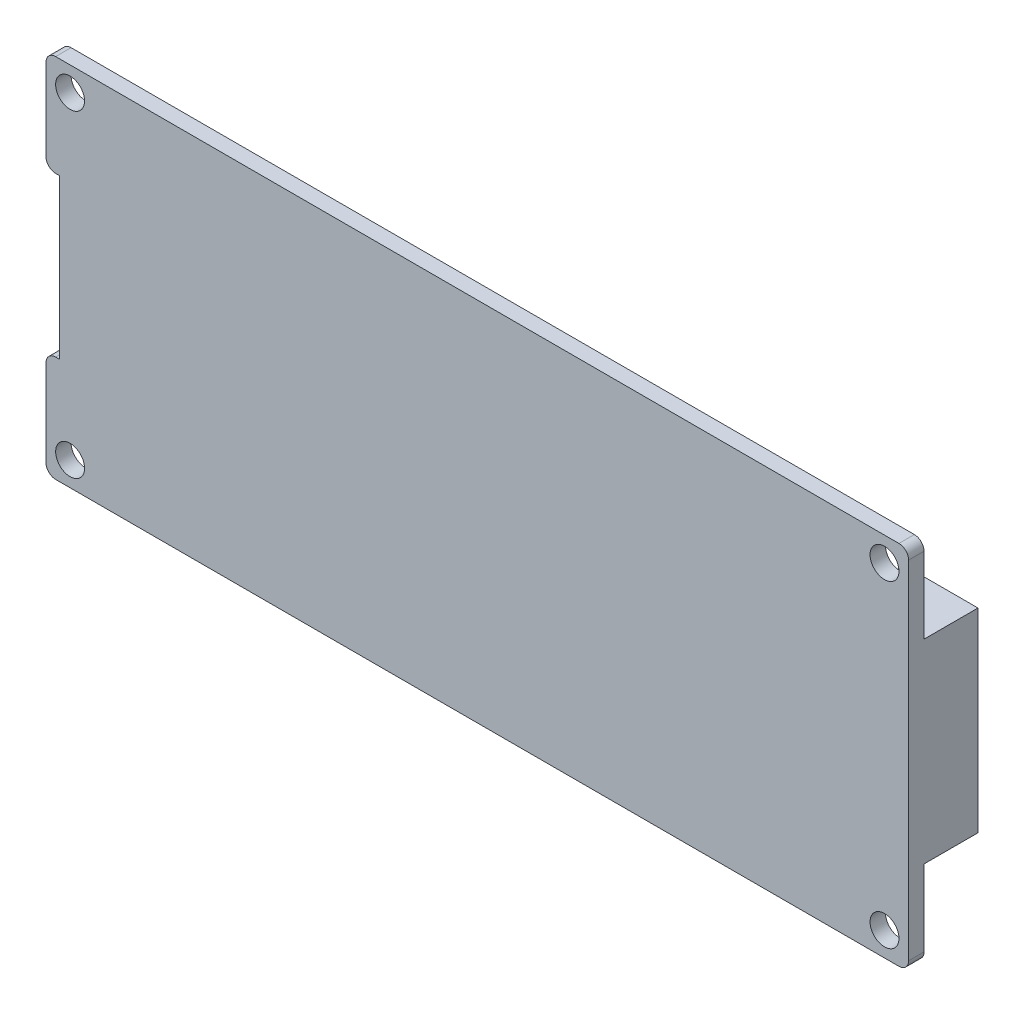
ISO-10303-21;
HEADER;
FILE_DESCRIPTION(('STEP AP214'),'2;1');
FILE_NAME('part.step','',(''),(''),'','','');
FILE_SCHEMA(('AUTOMOTIVE_DESIGN { 1 0 10303 214 1 1 1 1 }'));
ENDSEC;
DATA;
#1=APPLICATION_CONTEXT('core data for automotive mechanical design processes');
#2=APPLICATION_PROTOCOL_DEFINITION('international standard','automotive_design',2000,#1);
#3=PRODUCT_CONTEXT('',#1,'mechanical');
#4=PRODUCT('Part','Part','',(#3));
#5=PRODUCT_RELATED_PRODUCT_CATEGORY('part','',(#4));
#6=PRODUCT_DEFINITION_FORMATION('','',#4);
#7=PRODUCT_DEFINITION_CONTEXT('part definition',#1,'design');
#8=PRODUCT_DEFINITION('design','',#6,#7);
#9=PRODUCT_DEFINITION_SHAPE('','',#8);
#10=(LENGTH_UNIT() NAMED_UNIT(*) SI_UNIT(.MILLI.,.METRE.));
#11=(NAMED_UNIT(*) PLANE_ANGLE_UNIT() SI_UNIT($,.RADIAN.));
#12=(NAMED_UNIT(*) SI_UNIT($,.STERADIAN.) SOLID_ANGLE_UNIT());
#13=UNCERTAINTY_MEASURE_WITH_UNIT(LENGTH_MEASURE(1.E-05),#10,'distance_accuracy_value','');
#14=(GEOMETRIC_REPRESENTATION_CONTEXT(3) GLOBAL_UNCERTAINTY_ASSIGNED_CONTEXT((#13)) GLOBAL_UNIT_ASSIGNED_CONTEXT((#10,
#11,#12)) REPRESENTATION_CONTEXT('',''));
#15=CARTESIAN_POINT('',(0.,0.,0.));
#16=DIRECTION('',(0.,0.,1.));
#17=DIRECTION('',(1.,0.,0.));
#18=AXIS2_PLACEMENT_3D('',#15,#16,#17);
#19=CARTESIAN_POINT('',(37.1,-10.1,0.));
#20=DIRECTION('',(-1.,0.,0.));
#21=DIRECTION('',(0.,0.,1.));
#22=AXIS2_PLACEMENT_3D('',#19,#20,#21);
#23=PLANE('',#22);
#24=DIRECTION('',(0.,1.,0.));
#25=VECTOR('',#24,1.);
#26=CARTESIAN_POINT('',(37.1,0.,-5.6));
#27=LINE('',#26,#25);
#28=CARTESIAN_POINT('',(37.1,-10.1,-5.6));
#29=VERTEX_POINT('',#28);
#30=CARTESIAN_POINT('',(37.1,10.1,-5.6));
#31=VERTEX_POINT('',#30);
#32=EDGE_CURVE('E153',#29,#31,#27,.T.);
#33=ORIENTED_EDGE('',*,*,#32,.F.);
#34=DIRECTION('',(0.,0.,-1.));
#35=VECTOR('',#34,1.);
#36=CARTESIAN_POINT('',(37.1,-10.1,0.));
#37=LINE('',#36,#35);
#38=CARTESIAN_POINT('',(37.1,-10.1,0.));
#39=VERTEX_POINT('',#38);
#40=EDGE_CURVE('E147',#39,#29,#37,.T.);
#41=ORIENTED_EDGE('',*,*,#40,.F.);
#42=DIRECTION('',(0.,1.,0.));
#43=VECTOR('',#42,1.);
#44=CARTESIAN_POINT('',(37.1,0.,0.));
#45=LINE('',#44,#43);
#46=CARTESIAN_POINT('',(37.1,10.1,0.));
#47=VERTEX_POINT('',#46);
#48=EDGE_CURVE('E151',#39,#47,#45,.T.);
#49=ORIENTED_EDGE('',*,*,#48,.T.);
#50=DIRECTION('',(0.,0.,1.));
#51=VECTOR('',#50,1.);
#52=CARTESIAN_POINT('',(37.1,10.1,0.));
#53=LINE('',#52,#51);
#54=EDGE_CURVE('E188',#31,#47,#53,.T.);
#55=ORIENTED_EDGE('',*,*,#54,.F.);
#56=EDGE_LOOP('',(#33,#41,#49,#55));
#57=FACE_BOUND('',#56,.T.);
#58=ADVANCED_FACE('F17',(#57),#23,.T.);
#59=CARTESIAN_POINT('',(-43.35,-8.,0.));
#60=DIRECTION('',(0.,1.,0.));
#61=DIRECTION('',(-1.,0.,0.));
#62=AXIS2_PLACEMENT_3D('',#59,#60,#61);
#63=PLANE('',#62);
#64=DIRECTION('',(-1.,0.,0.));
#65=VECTOR('',#64,1.);
#66=CARTESIAN_POINT('',(-43.35,-8.,1.6));
#67=LINE('',#66,#65);
#68=CARTESIAN_POINT('',(-43.75,-8.,1.6));
#69=VERTEX_POINT('',#68);
#70=CARTESIAN_POINT('',(-43.35,-8.,1.6));
#71=VERTEX_POINT('',#70);
#72=EDGE_CURVE('E157',#69,#71,#67,.F.);
#73=ORIENTED_EDGE('',*,*,#72,.T.);
#74=DIRECTION('',(0.,0.,1.));
#75=VECTOR('',#74,1.);
#76=CARTESIAN_POINT('',(-43.35,-8.,0.));
#77=LINE('',#76,#75);
#78=CARTESIAN_POINT('',(-43.35,-8.,0.));
#79=VERTEX_POINT('',#78);
#80=EDGE_CURVE('E181',#79,#71,#77,.T.);
#81=ORIENTED_EDGE('',*,*,#80,.F.);
#82=DIRECTION('',(1.,0.,0.));
#83=VECTOR('',#82,1.);
#84=CARTESIAN_POINT('',(0.,-8.,0.));
#85=LINE('',#84,#83);
#86=CARTESIAN_POINT('',(-43.75,-8.,0.));
#87=VERTEX_POINT('',#86);
#88=EDGE_CURVE('E166',#79,#87,#85,.F.);
#89=ORIENTED_EDGE('',*,*,#88,.T.);
#90=DIRECTION('',(0.,0.,1.));
#91=VECTOR('',#90,1.);
#92=CARTESIAN_POINT('',(-43.75,-7.99999999999999,0.));
#93=LINE('',#92,#91);
#94=EDGE_CURVE('E263',#69,#87,#93,.F.);
#95=ORIENTED_EDGE('',*,*,#94,.F.);
#96=EDGE_LOOP('',(#73,#81,#89,#95));
#97=FACE_BOUND('',#96,.T.);
#98=ADVANCED_FACE('F369',(#97),#63,.T.);
#99=CARTESIAN_POINT('',(44.75,-10.1,0.));
#100=DIRECTION('',(0.,-1.,0.));
#101=DIRECTION('',(0.,0.,-1.));
#102=AXIS2_PLACEMENT_3D('',#99,#100,#101);
#103=PLANE('',#102);
#104=DIRECTION('',(-1.,0.,0.));
#105=VECTOR('',#104,1.);
#106=CARTESIAN_POINT('',(40.925,-10.1,-5.6));
#107=LINE('',#106,#105);
#108=CARTESIAN_POINT('',(44.75,-10.1,-5.6));
#109=VERTEX_POINT('',#108);
#110=EDGE_CURVE('E156',#109,#29,#107,.T.);
#111=ORIENTED_EDGE('',*,*,#110,.F.);
#112=DIRECTION('',(0.,0.,-1.));
#113=VECTOR('',#112,1.);
#114=CARTESIAN_POINT('',(44.75,-10.1,0.));
#115=LINE('',#114,#113);
#116=CARTESIAN_POINT('',(44.75,-10.1,0.));
#117=VERTEX_POINT('',#116);
#118=EDGE_CURVE('E163',#117,#109,#115,.T.);
#119=ORIENTED_EDGE('',*,*,#118,.F.);
#120=DIRECTION('',(1.,0.,0.));
#121=VECTOR('',#120,1.);
#122=CARTESIAN_POINT('',(0.,-10.1,0.));
#123=LINE('',#122,#121);
#124=EDGE_CURVE('E160',#117,#39,#123,.F.);
#125=ORIENTED_EDGE('',*,*,#124,.T.);
#126=ORIENTED_EDGE('',*,*,#40,.T.);
#127=EDGE_LOOP('',(#111,#119,#125,#126));
#128=FACE_BOUND('',#127,.T.);
#129=ADVANCED_FACE('F161',(#128),#103,.T.);
#130=CARTESIAN_POINT('',(40.925,0.,-5.6));
#131=DIRECTION('',(0.,0.,-1.));
#132=DIRECTION('',(-1.,0.,0.));
#133=AXIS2_PLACEMENT_3D('',#130,#131,#132);
#134=PLANE('',#133);
#135=DIRECTION('',(1.,0.,0.));
#136=VECTOR('',#135,1.);
#137=CARTESIAN_POINT('',(37.1,10.1,-5.6));
#138=LINE('',#137,#136);
#139=CARTESIAN_POINT('',(44.75,10.1,-5.6));
#140=VERTEX_POINT('',#139);
#141=EDGE_CURVE('E190',#140,#31,#138,.F.);
#142=ORIENTED_EDGE('',*,*,#141,.F.);
#143=DIRECTION('',(0.,1.,0.));
#144=VECTOR('',#143,1.);
#145=CARTESIAN_POINT('',(44.75,-18.,-5.6));
#146=LINE('',#145,#144);
#147=EDGE_CURVE('E200',#109,#140,#146,.T.);
#148=ORIENTED_EDGE('',*,*,#147,.F.);
#149=ORIENTED_EDGE('',*,*,#110,.T.);
#150=ORIENTED_EDGE('',*,*,#32,.T.);
#151=EDGE_LOOP('',(#142,#148,#149,#150));
#152=FACE_BOUND('',#151,.T.);
#153=ADVANCED_FACE('F414',(#152),#134,.T.);
#154=CARTESIAN_POINT('',(37.1,10.1,0.));
#155=DIRECTION('',(0.,1.,0.));
#156=DIRECTION('',(0.,0.,1.));
#157=AXIS2_PLACEMENT_3D('',#154,#155,#156);
#158=PLANE('',#157);
#159=ORIENTED_EDGE('',*,*,#141,.T.);
#160=ORIENTED_EDGE('',*,*,#54,.T.);
#161=DIRECTION('',(1.,0.,0.));
#162=VECTOR('',#161,1.);
#163=CARTESIAN_POINT('',(0.,10.1,0.));
#164=LINE('',#163,#162);
#165=CARTESIAN_POINT('',(44.75,10.1,0.));
#166=VERTEX_POINT('',#165);
#167=EDGE_CURVE('E171',#47,#166,#164,.T.);
#168=ORIENTED_EDGE('',*,*,#167,.T.);
#169=DIRECTION('',(0.,0.,-1.));
#170=VECTOR('',#169,1.);
#171=CARTESIAN_POINT('',(44.75,10.1,0.));
#172=LINE('',#171,#170);
#173=EDGE_CURVE('E203',#140,#166,#172,.F.);
#174=ORIENTED_EDGE('',*,*,#173,.F.);
#175=EDGE_LOOP('',(#159,#160,#168,#174));
#176=FACE_BOUND('',#175,.T.);
#177=ADVANCED_FACE('F411',(#176),#158,.T.);
#178=CARTESIAN_POINT('',(0.,0.,0.));
#179=DIRECTION('',(0.,0.,1.));
#180=DIRECTION('',(1.,0.,0.));
#181=AXIS2_PLACEMENT_3D('',#178,#179,#180);
#182=PLANE('',#181);
#183=ORIENTED_EDGE('',*,*,#124,.F.);
#184=DIRECTION('',(0.,1.,0.));
#185=VECTOR('',#184,1.);
#186=CARTESIAN_POINT('',(44.75,-18.,0.));
#187=LINE('',#186,#185);
#188=CARTESIAN_POINT('',(44.75,-18.,0.));
#189=VERTEX_POINT('',#188);
#190=EDGE_CURVE('E297',#189,#117,#187,.T.);
#191=ORIENTED_EDGE('',*,*,#190,.F.);
#192=CARTESIAN_POINT('',(43.75,-18.,0.));
#193=DIRECTION('',(0.,0.,1.));
#194=DIRECTION('',(1.,0.,0.));
#195=AXIS2_PLACEMENT_3D('',#192,#193,#194);
#196=CIRCLE('',#195,0.999999999999994);
#197=CARTESIAN_POINT('',(43.75,-19.,0.));
#198=VERTEX_POINT('',#197);
#199=EDGE_CURVE('E251',#198,#189,#196,.T.);
#200=ORIENTED_EDGE('',*,*,#199,.F.);
#201=DIRECTION('',(1.,0.,0.));
#202=VECTOR('',#201,1.);
#203=CARTESIAN_POINT('',(-43.75,-19.,0.));
#204=LINE('',#203,#202);
#205=CARTESIAN_POINT('',(-43.75,-19.,0.));
#206=VERTEX_POINT('',#205);
#207=EDGE_CURVE('E313',#206,#198,#204,.T.);
#208=ORIENTED_EDGE('',*,*,#207,.F.);
#209=CARTESIAN_POINT('',(-43.75,-18.,0.));
#210=DIRECTION('',(0.,0.,1.));
#211=DIRECTION('',(1.,0.,0.));
#212=AXIS2_PLACEMENT_3D('',#209,#210,#211);
#213=CIRCLE('',#212,0.999999999999996);
#214=CARTESIAN_POINT('',(-44.75,-18.,0.));
#215=VERTEX_POINT('',#214);
#216=EDGE_CURVE('E255',#215,#206,#213,.T.);
#217=ORIENTED_EDGE('',*,*,#216,.F.);
#218=DIRECTION('',(0.,1.,0.));
#219=VECTOR('',#218,1.);
#220=CARTESIAN_POINT('',(-44.75,-9.,0.));
#221=LINE('',#220,#219);
#222=CARTESIAN_POINT('',(-44.75,-8.99999999999999,0.));
#223=VERTEX_POINT('',#222);
#224=EDGE_CURVE('E316',#223,#215,#221,.F.);
#225=ORIENTED_EDGE('',*,*,#224,.F.);
#226=CARTESIAN_POINT('',(-43.75,-8.99999999999999,0.));
#227=DIRECTION('',(0.,0.,1.));
#228=DIRECTION('',(1.,0.,0.));
#229=AXIS2_PLACEMENT_3D('',#226,#227,#228);
#230=CIRCLE('',#229,0.999999999999996);
#231=EDGE_CURVE('E260',#87,#223,#230,.T.);
#232=ORIENTED_EDGE('',*,*,#231,.F.);
#233=ORIENTED_EDGE('',*,*,#88,.F.);
#234=DIRECTION('',(0.,1.,0.));
#235=VECTOR('',#234,1.);
#236=CARTESIAN_POINT('',(-43.35,8.5,0.));
#237=LINE('',#236,#235);
#238=CARTESIAN_POINT('',(-43.35,8.5,0.));
#239=VERTEX_POINT('',#238);
#240=EDGE_CURVE('E185',#239,#79,#237,.F.);
#241=ORIENTED_EDGE('',*,*,#240,.F.);
#242=DIRECTION('',(1.,0.,0.));
#243=VECTOR('',#242,1.);
#244=CARTESIAN_POINT('',(-43.75,8.5,0.));
#245=LINE('',#244,#243);
#246=CARTESIAN_POINT('',(-43.75,8.5,0.));
#247=VERTEX_POINT('',#246);
#248=EDGE_CURVE('E172',#247,#239,#245,.T.);
#249=ORIENTED_EDGE('',*,*,#248,.F.);
#250=CARTESIAN_POINT('',(-43.75,9.5,0.));
#251=DIRECTION('',(0.,0.,1.));
#252=DIRECTION('',(1.,0.,0.));
#253=AXIS2_PLACEMENT_3D('',#250,#251,#252);
#254=CIRCLE('',#253,0.999999999999996);
#255=CARTESIAN_POINT('',(-44.75,9.5,0.));
#256=VERTEX_POINT('',#255);
#257=EDGE_CURVE('E20',#256,#247,#254,.T.);
#258=ORIENTED_EDGE('',*,*,#257,.F.);
#259=DIRECTION('',(0.,1.,0.));
#260=VECTOR('',#259,1.);
#261=CARTESIAN_POINT('',(-44.75,18.,0.));
#262=LINE('',#261,#260);
#263=CARTESIAN_POINT('',(-44.75,18.,0.));
#264=VERTEX_POINT('',#263);
#265=EDGE_CURVE('E279',#264,#256,#262,.F.);
#266=ORIENTED_EDGE('',*,*,#265,.F.);
#267=CARTESIAN_POINT('',(-43.75,18.,0.));
#268=DIRECTION('',(0.,0.,1.));
#269=DIRECTION('',(1.,0.,0.));
#270=AXIS2_PLACEMENT_3D('',#267,#268,#269);
#271=CIRCLE('',#270,0.999999999999994);
#272=CARTESIAN_POINT('',(-43.75,19.,0.));
#273=VERTEX_POINT('',#272);
#274=EDGE_CURVE('E242',#273,#264,#271,.T.);
#275=ORIENTED_EDGE('',*,*,#274,.F.);
#276=DIRECTION('',(-1.,0.,0.));
#277=VECTOR('',#276,1.);
#278=CARTESIAN_POINT('',(43.75,19.,0.));
#279=LINE('',#278,#277);
#280=CARTESIAN_POINT('',(43.75,19.,0.));
#281=VERTEX_POINT('',#280);
#282=EDGE_CURVE('E288',#281,#273,#279,.T.);
#283=ORIENTED_EDGE('',*,*,#282,.F.);
#284=CARTESIAN_POINT('',(43.75,18.,0.));
#285=DIRECTION('',(0.,0.,1.));
#286=DIRECTION('',(1.,0.,0.));
#287=AXIS2_PLACEMENT_3D('',#284,#285,#286);
#288=CIRCLE('',#287,0.999999999999996);
#289=CARTESIAN_POINT('',(44.75,18.,0.));
#290=VERTEX_POINT('',#289);
#291=EDGE_CURVE('E247',#290,#281,#288,.T.);
#292=ORIENTED_EDGE('',*,*,#291,.F.);
#293=DIRECTION('',(0.,1.,0.));
#294=VECTOR('',#293,1.);
#295=CARTESIAN_POINT('',(44.75,-18.,0.));
#296=LINE('',#295,#294);
#297=EDGE_CURVE('E291',#166,#290,#296,.T.);
#298=ORIENTED_EDGE('',*,*,#297,.F.);
#299=ORIENTED_EDGE('',*,*,#167,.F.);
#300=ORIENTED_EDGE('',*,*,#48,.F.);
#301=EDGE_LOOP('',(#183,#191,#200,#208,#217,#225,#232,#233,#241,#249,#258,#266,#275,#283,#292,
#298,#299,#300));
#302=FACE_BOUND('',#301,.T.);
#303=CARTESIAN_POINT('',(-42.25,16.5,0.));
#304=DIRECTION('',(0.,0.,1.));
#305=DIRECTION('',(1.,0.,0.));
#306=AXIS2_PLACEMENT_3D('',#303,#304,#305);
#307=CIRCLE('',#306,1.49999999999999);
#308=CARTESIAN_POINT('',(-40.75,16.5,0.));
#309=VERTEX_POINT('',#308);
#310=EDGE_CURVE('E264',#309,#309,#307,.T.);
#311=ORIENTED_EDGE('',*,*,#310,.T.);
#312=EDGE_LOOP('',(#311));
#313=FACE_BOUND('',#312,.T.);
#314=CARTESIAN_POINT('',(42.25,16.5,0.));
#315=DIRECTION('',(0.,0.,1.));
#316=DIRECTION('',(1.,0.,0.));
#317=AXIS2_PLACEMENT_3D('',#314,#315,#316);
#318=CIRCLE('',#317,1.49999999999999);
#319=CARTESIAN_POINT('',(43.75,16.5,0.));
#320=VERTEX_POINT('',#319);
#321=EDGE_CURVE('E267',#320,#320,#318,.T.);
#322=ORIENTED_EDGE('',*,*,#321,.T.);
#323=EDGE_LOOP('',(#322));
#324=FACE_BOUND('',#323,.T.);
#325=CARTESIAN_POINT('',(42.25,-16.5,0.));
#326=DIRECTION('',(0.,0.,1.));
#327=DIRECTION('',(1.,0.,0.));
#328=AXIS2_PLACEMENT_3D('',#325,#326,#327);
#329=CIRCLE('',#328,1.49999999999999);
#330=CARTESIAN_POINT('',(43.75,-16.5,0.));
#331=VERTEX_POINT('',#330);
#332=EDGE_CURVE('E270',#331,#331,#329,.T.);
#333=ORIENTED_EDGE('',*,*,#332,.T.);
#334=EDGE_LOOP('',(#333));
#335=FACE_BOUND('',#334,.T.);
#336=CARTESIAN_POINT('',(-42.25,-16.5,0.));
#337=DIRECTION('',(0.,0.,1.));
#338=DIRECTION('',(1.,0.,0.));
#339=AXIS2_PLACEMENT_3D('',#336,#337,#338);
#340=CIRCLE('',#339,1.49999999999999);
#341=CARTESIAN_POINT('',(-40.75,-16.5,0.));
#342=VERTEX_POINT('',#341);
#343=EDGE_CURVE('E272',#342,#342,#340,.T.);
#344=ORIENTED_EDGE('',*,*,#343,.T.);
#345=EDGE_LOOP('',(#344));
#346=FACE_BOUND('',#345,.T.);
#347=ADVANCED_FACE('F168',(#302,#313,#324,#335,#346),#182,.F.);
#348=CARTESIAN_POINT('',(-43.75,8.5,0.));
#349=DIRECTION('',(0.,-1.,0.));
#350=DIRECTION('',(0.,0.,-1.));
#351=AXIS2_PLACEMENT_3D('',#348,#349,#350);
#352=PLANE('',#351);
#353=DIRECTION('',(1.,0.,0.));
#354=VECTOR('',#353,1.);
#355=CARTESIAN_POINT('',(-43.75,8.5,1.6));
#356=LINE('',#355,#354);
#357=CARTESIAN_POINT('',(-43.35,8.5,1.6));
#358=VERTEX_POINT('',#357);
#359=CARTESIAN_POINT('',(-43.75,8.5,1.6));
#360=VERTEX_POINT('',#359);
#361=EDGE_CURVE('E35',#358,#360,#356,.F.);
#362=ORIENTED_EDGE('',*,*,#361,.T.);
#363=DIRECTION('',(0.,0.,1.));
#364=VECTOR('',#363,1.);
#365=CARTESIAN_POINT('',(-43.75,8.5,0.));
#366=LINE('',#365,#364);
#367=EDGE_CURVE('E338',#247,#360,#366,.T.);
#368=ORIENTED_EDGE('',*,*,#367,.F.);
#369=ORIENTED_EDGE('',*,*,#248,.T.);
#370=DIRECTION('',(0.,0.,1.));
#371=VECTOR('',#370,1.);
#372=CARTESIAN_POINT('',(-43.35,8.5,0.));
#373=LINE('',#372,#371);
#374=EDGE_CURVE('E184',#358,#239,#373,.F.);
#375=ORIENTED_EDGE('',*,*,#374,.F.);
#376=EDGE_LOOP('',(#362,#368,#369,#375));
#377=FACE_BOUND('',#376,.T.);
#378=ADVANCED_FACE('F337',(#377),#352,.T.);
#379=CARTESIAN_POINT('',(-42.25,-16.5,0.));
#380=DIRECTION('',(0.,0.,1.));
#381=DIRECTION('',(1.,0.,0.));
#382=AXIS2_PLACEMENT_3D('',#379,#380,#381);
#383=CYLINDRICAL_SURFACE('',#382,1.49999999999999);
#384=CARTESIAN_POINT('',(-42.25,-16.5,1.6));
#385=DIRECTION('',(0.,0.,1.));
#386=DIRECTION('',(1.,0.,0.));
#387=AXIS2_PLACEMENT_3D('',#384,#385,#386);
#388=CIRCLE('',#387,1.49999999999999);
#389=CARTESIAN_POINT('',(-40.75,-16.5,1.6));
#390=VERTEX_POINT('',#389);
#391=EDGE_CURVE('E238',#390,#390,#388,.F.);
#392=ORIENTED_EDGE('',*,*,#391,.F.);
#393=EDGE_LOOP('',(#392));
#394=FACE_BOUND('',#393,.T.);
#395=ORIENTED_EDGE('',*,*,#343,.F.);
#396=EDGE_LOOP('',(#395));
#397=FACE_BOUND('',#396,.T.);
#398=ADVANCED_FACE('F393',(#394,#397),#383,.F.);
#399=CARTESIAN_POINT('',(42.25,-16.5,0.));
#400=DIRECTION('',(0.,0.,1.));
#401=DIRECTION('',(1.,0.,0.));
#402=AXIS2_PLACEMENT_3D('',#399,#400,#401);
#403=CYLINDRICAL_SURFACE('',#402,1.49999999999999);
#404=CARTESIAN_POINT('',(42.25,-16.5,1.6));
#405=DIRECTION('',(0.,0.,1.));
#406=DIRECTION('',(1.,0.,0.));
#407=AXIS2_PLACEMENT_3D('',#404,#405,#406);
#408=CIRCLE('',#407,1.49999999999999);
#409=CARTESIAN_POINT('',(43.75,-16.5,1.6));
#410=VERTEX_POINT('',#409);
#411=EDGE_CURVE('E235',#410,#410,#408,.F.);
#412=ORIENTED_EDGE('',*,*,#411,.F.);
#413=EDGE_LOOP('',(#412));
#414=FACE_BOUND('',#413,.T.);
#415=ORIENTED_EDGE('',*,*,#332,.F.);
#416=EDGE_LOOP('',(#415));
#417=FACE_BOUND('',#416,.T.);
#418=ADVANCED_FACE('F396',(#414,#417),#403,.F.);
#419=CARTESIAN_POINT('',(42.25,16.5,0.));
#420=DIRECTION('',(0.,0.,1.));
#421=DIRECTION('',(1.,0.,0.));
#422=AXIS2_PLACEMENT_3D('',#419,#420,#421);
#423=CYLINDRICAL_SURFACE('',#422,1.49999999999999);
#424=CARTESIAN_POINT('',(42.25,16.5,1.6));
#425=DIRECTION('',(0.,0.,1.));
#426=DIRECTION('',(1.,0.,0.));
#427=AXIS2_PLACEMENT_3D('',#424,#425,#426);
#428=CIRCLE('',#427,1.49999999999999);
#429=CARTESIAN_POINT('',(43.75,16.5,1.6));
#430=VERTEX_POINT('',#429);
#431=EDGE_CURVE('E232',#430,#430,#428,.F.);
#432=ORIENTED_EDGE('',*,*,#431,.F.);
#433=EDGE_LOOP('',(#432));
#434=FACE_BOUND('',#433,.T.);
#435=ORIENTED_EDGE('',*,*,#321,.F.);
#436=EDGE_LOOP('',(#435));
#437=FACE_BOUND('',#436,.T.);
#438=ADVANCED_FACE('F403',(#434,#437),#423,.F.);
#439=CARTESIAN_POINT('',(-42.25,16.5,0.));
#440=DIRECTION('',(0.,0.,1.));
#441=DIRECTION('',(1.,0.,0.));
#442=AXIS2_PLACEMENT_3D('',#439,#440,#441);
#443=CYLINDRICAL_SURFACE('',#442,1.49999999999999);
#444=CARTESIAN_POINT('',(-42.25,16.5,1.6));
#445=DIRECTION('',(0.,0.,1.));
#446=DIRECTION('',(1.,0.,0.));
#447=AXIS2_PLACEMENT_3D('',#444,#445,#446);
#448=CIRCLE('',#447,1.49999999999999);
#449=CARTESIAN_POINT('',(-40.75,16.5,1.6));
#450=VERTEX_POINT('',#449);
#451=EDGE_CURVE('E229',#450,#450,#448,.F.);
#452=ORIENTED_EDGE('',*,*,#451,.F.);
#453=EDGE_LOOP('',(#452));
#454=FACE_BOUND('',#453,.T.);
#455=ORIENTED_EDGE('',*,*,#310,.F.);
#456=EDGE_LOOP('',(#455));
#457=FACE_BOUND('',#456,.T.);
#458=ADVANCED_FACE('F486',(#454,#457),#443,.F.);
#459=CARTESIAN_POINT('',(-43.35,8.5,0.));
#460=DIRECTION('',(-1.,0.,0.));
#461=DIRECTION('',(0.,0.,1.));
#462=AXIS2_PLACEMENT_3D('',#459,#460,#461);
#463=PLANE('',#462);
#464=DIRECTION('',(0.,1.,0.));
#465=VECTOR('',#464,1.);
#466=CARTESIAN_POINT('',(-43.35,0.,1.6));
#467=LINE('',#466,#465);
#468=EDGE_CURVE('E228',#358,#71,#467,.F.);
#469=ORIENTED_EDGE('',*,*,#468,.F.);
#470=ORIENTED_EDGE('',*,*,#374,.T.);
#471=ORIENTED_EDGE('',*,*,#240,.T.);
#472=ORIENTED_EDGE('',*,*,#80,.T.);
#473=EDGE_LOOP('',(#469,#470,#471,#472));
#474=FACE_BOUND('',#473,.T.);
#475=ADVANCED_FACE('F334',(#474),#463,.T.);
#476=CARTESIAN_POINT('',(-43.75,-8.99999999999999,0.));
#477=DIRECTION('',(0.,0.,1.));
#478=DIRECTION('',(1.,0.,0.));
#479=AXIS2_PLACEMENT_3D('',#476,#477,#478);
#480=CYLINDRICAL_SURFACE('',#479,0.999999999999996);
#481=CARTESIAN_POINT('',(-43.75,-8.99999999999999,1.6));
#482=DIRECTION('',(0.,0.,1.));
#483=DIRECTION('',(1.,0.,0.));
#484=AXIS2_PLACEMENT_3D('',#481,#482,#483);
#485=CIRCLE('',#484,0.999999999999996);
#486=CARTESIAN_POINT('',(-44.75,-8.99999999999999,1.6));
#487=VERTEX_POINT('',#486);
#488=EDGE_CURVE('E225',#69,#487,#485,.T.);
#489=ORIENTED_EDGE('',*,*,#488,.F.);
#490=ORIENTED_EDGE('',*,*,#94,.T.);
#491=ORIENTED_EDGE('',*,*,#231,.T.);
#492=DIRECTION('',(0.,0.,1.));
#493=VECTOR('',#492,1.);
#494=CARTESIAN_POINT('',(-44.75,-9.,0.));
#495=LINE('',#494,#493);
#496=EDGE_CURVE('E259',#487,#223,#495,.F.);
#497=ORIENTED_EDGE('',*,*,#496,.F.);
#498=EDGE_LOOP('',(#489,#490,#491,#497));
#499=FACE_BOUND('',#498,.T.);
#500=ADVANCED_FACE('F367',(#499),#480,.T.);
#501=CARTESIAN_POINT('',(-44.75,-9.,0.));
#502=DIRECTION('',(-1.,0.,0.));
#503=DIRECTION('',(0.,0.,1.));
#504=AXIS2_PLACEMENT_3D('',#501,#502,#503);
#505=PLANE('',#504);
#506=DIRECTION('',(0.,1.,0.));
#507=VECTOR('',#506,1.);
#508=CARTESIAN_POINT('',(-44.75,0.,1.6));
#509=LINE('',#508,#507);
#510=CARTESIAN_POINT('',(-44.75,-18.,1.6));
#511=VERTEX_POINT('',#510);
#512=EDGE_CURVE('E224',#487,#511,#509,.F.);
#513=ORIENTED_EDGE('',*,*,#512,.F.);
#514=ORIENTED_EDGE('',*,*,#496,.T.);
#515=ORIENTED_EDGE('',*,*,#224,.T.);
#516=DIRECTION('',(0.,0.,1.));
#517=VECTOR('',#516,1.);
#518=CARTESIAN_POINT('',(-44.75,-18.,0.));
#519=LINE('',#518,#517);
#520=EDGE_CURVE('E258',#511,#215,#519,.F.);
#521=ORIENTED_EDGE('',*,*,#520,.F.);
#522=EDGE_LOOP('',(#513,#514,#515,#521));
#523=FACE_BOUND('',#522,.T.);
#524=ADVANCED_FACE('F372',(#523),#505,.T.);
#525=CARTESIAN_POINT('',(-43.75,-18.,0.));
#526=DIRECTION('',(0.,0.,1.));
#527=DIRECTION('',(1.,0.,0.));
#528=AXIS2_PLACEMENT_3D('',#525,#526,#527);
#529=CYLINDRICAL_SURFACE('',#528,0.999999999999996);
#530=CARTESIAN_POINT('',(-43.75,-18.,1.6));
#531=DIRECTION('',(0.,0.,1.));
#532=DIRECTION('',(1.,0.,0.));
#533=AXIS2_PLACEMENT_3D('',#530,#531,#532);
#534=CIRCLE('',#533,0.999999999999996);
#535=CARTESIAN_POINT('',(-43.75,-19.,1.6));
#536=VERTEX_POINT('',#535);
#537=EDGE_CURVE('E221',#511,#536,#534,.T.);
#538=ORIENTED_EDGE('',*,*,#537,.F.);
#539=ORIENTED_EDGE('',*,*,#520,.T.);
#540=ORIENTED_EDGE('',*,*,#216,.T.);
#541=DIRECTION('',(0.,0.,-1.));
#542=VECTOR('',#541,1.);
#543=CARTESIAN_POINT('',(-43.75,-19.,0.));
#544=LINE('',#543,#542);
#545=EDGE_CURVE('E254',#536,#206,#544,.T.);
#546=ORIENTED_EDGE('',*,*,#545,.F.);
#547=EDGE_LOOP('',(#538,#539,#540,#546));
#548=FACE_BOUND('',#547,.T.);
#549=ADVANCED_FACE('F375',(#548),#529,.T.);
#550=CARTESIAN_POINT('',(-43.75,-19.,0.));
#551=DIRECTION('',(0.,-1.,0.));
#552=DIRECTION('',(0.,0.,-1.));
#553=AXIS2_PLACEMENT_3D('',#550,#551,#552);
#554=PLANE('',#553);
#555=DIRECTION('',(1.,0.,0.));
#556=VECTOR('',#555,1.);
#557=CARTESIAN_POINT('',(0.,-19.,1.6));
#558=LINE('',#557,#556);
#559=CARTESIAN_POINT('',(43.75,-19.,1.6));
#560=VERTEX_POINT('',#559);
#561=EDGE_CURVE('E220',#536,#560,#558,.T.);
#562=ORIENTED_EDGE('',*,*,#561,.F.);
#563=ORIENTED_EDGE('',*,*,#545,.T.);
#564=ORIENTED_EDGE('',*,*,#207,.T.);
#565=DIRECTION('',(0.,0.,1.));
#566=VECTOR('',#565,1.);
#567=CARTESIAN_POINT('',(43.75,-19.,0.));
#568=LINE('',#567,#566);
#569=EDGE_CURVE('E253',#560,#198,#568,.F.);
#570=ORIENTED_EDGE('',*,*,#569,.F.);
#571=EDGE_LOOP('',(#562,#563,#564,#570));
#572=FACE_BOUND('',#571,.T.);
#573=ADVANCED_FACE('F528',(#572),#554,.T.);
#574=CARTESIAN_POINT('',(43.75,-18.,0.));
#575=DIRECTION('',(0.,0.,1.));
#576=DIRECTION('',(1.,0.,0.));
#577=AXIS2_PLACEMENT_3D('',#574,#575,#576);
#578=CYLINDRICAL_SURFACE('',#577,0.999999999999994);
#579=CARTESIAN_POINT('',(43.75,-18.,1.6));
#580=DIRECTION('',(0.,0.,1.));
#581=DIRECTION('',(1.,0.,0.));
#582=AXIS2_PLACEMENT_3D('',#579,#580,#581);
#583=CIRCLE('',#582,0.999999999999994);
#584=CARTESIAN_POINT('',(44.75,-18.,1.6));
#585=VERTEX_POINT('',#584);
#586=EDGE_CURVE('E217',#560,#585,#583,.T.);
#587=ORIENTED_EDGE('',*,*,#586,.F.);
#588=ORIENTED_EDGE('',*,*,#569,.T.);
#589=ORIENTED_EDGE('',*,*,#199,.T.);
#590=DIRECTION('',(0.,0.,-1.));
#591=VECTOR('',#590,1.);
#592=CARTESIAN_POINT('',(44.75,-18.,0.));
#593=LINE('',#592,#591);
#594=EDGE_CURVE('E294',#585,#189,#593,.T.);
#595=ORIENTED_EDGE('',*,*,#594,.F.);
#596=EDGE_LOOP('',(#587,#588,#589,#595));
#597=FACE_BOUND('',#596,.T.);
#598=ADVANCED_FACE('F537',(#597),#578,.T.);
#599=CARTESIAN_POINT('',(44.75,-18.,0.));
#600=DIRECTION('',(1.,0.,0.));
#601=DIRECTION('',(0.,0.,-1.));
#602=AXIS2_PLACEMENT_3D('',#599,#600,#601);
#603=PLANE('',#602);
#604=ORIENTED_EDGE('',*,*,#147,.T.);
#605=ORIENTED_EDGE('',*,*,#173,.T.);
#606=ORIENTED_EDGE('',*,*,#297,.T.);
#607=DIRECTION('',(0.,0.,1.));
#608=VECTOR('',#607,1.);
#609=CARTESIAN_POINT('',(44.75,18.,0.));
#610=LINE('',#609,#608);
#611=CARTESIAN_POINT('',(44.75,18.,1.6));
#612=VERTEX_POINT('',#611);
#613=EDGE_CURVE('E250',#612,#290,#610,.F.);
#614=ORIENTED_EDGE('',*,*,#613,.F.);
#615=DIRECTION('',(0.,1.,0.));
#616=VECTOR('',#615,1.);
#617=CARTESIAN_POINT('',(44.75,0.,1.6));
#618=LINE('',#617,#616);
#619=EDGE_CURVE('E216',#585,#612,#618,.T.);
#620=ORIENTED_EDGE('',*,*,#619,.F.);
#621=ORIENTED_EDGE('',*,*,#594,.T.);
#622=ORIENTED_EDGE('',*,*,#190,.T.);
#623=ORIENTED_EDGE('',*,*,#118,.T.);
#624=EDGE_LOOP('',(#604,#605,#606,#614,#620,#621,#622,#623));
#625=FACE_BOUND('',#624,.T.);
#626=ADVANCED_FACE('F547',(#625),#603,.T.);
#627=CARTESIAN_POINT('',(43.75,18.,0.));
#628=DIRECTION('',(0.,0.,1.));
#629=DIRECTION('',(1.,0.,0.));
#630=AXIS2_PLACEMENT_3D('',#627,#628,#629);
#631=CYLINDRICAL_SURFACE('',#630,0.999999999999996);
#632=CARTESIAN_POINT('',(43.75,18.,1.6));
#633=DIRECTION('',(0.,0.,1.));
#634=DIRECTION('',(1.,0.,0.));
#635=AXIS2_PLACEMENT_3D('',#632,#633,#634);
#636=CIRCLE('',#635,0.999999999999996);
#637=CARTESIAN_POINT('',(43.75,19.,1.6));
#638=VERTEX_POINT('',#637);
#639=EDGE_CURVE('E213',#612,#638,#636,.T.);
#640=ORIENTED_EDGE('',*,*,#639,.F.);
#641=ORIENTED_EDGE('',*,*,#613,.T.);
#642=ORIENTED_EDGE('',*,*,#291,.T.);
#643=DIRECTION('',(0.,0.,1.));
#644=VECTOR('',#643,1.);
#645=CARTESIAN_POINT('',(43.75,19.,0.));
#646=LINE('',#645,#644);
#647=EDGE_CURVE('E246',#638,#281,#646,.F.);
#648=ORIENTED_EDGE('',*,*,#647,.F.);
#649=EDGE_LOOP('',(#640,#641,#642,#648));
#650=FACE_BOUND('',#649,.T.);
#651=ADVANCED_FACE('F557',(#650),#631,.T.);
#652=CARTESIAN_POINT('',(43.75,19.,0.));
#653=DIRECTION('',(0.,1.,0.));
#654=DIRECTION('',(-1.,0.,0.));
#655=AXIS2_PLACEMENT_3D('',#652,#653,#654);
#656=PLANE('',#655);
#657=DIRECTION('',(1.,0.,0.));
#658=VECTOR('',#657,1.);
#659=CARTESIAN_POINT('',(0.,19.,1.6));
#660=LINE('',#659,#658);
#661=CARTESIAN_POINT('',(-43.75,19.,1.6));
#662=VERTEX_POINT('',#661);
#663=EDGE_CURVE('E212',#638,#662,#660,.F.);
#664=ORIENTED_EDGE('',*,*,#663,.F.);
#665=ORIENTED_EDGE('',*,*,#647,.T.);
#666=ORIENTED_EDGE('',*,*,#282,.T.);
#667=DIRECTION('',(0.,0.,1.));
#668=VECTOR('',#667,1.);
#669=CARTESIAN_POINT('',(-43.75,19.,0.));
#670=LINE('',#669,#668);
#671=EDGE_CURVE('E245',#662,#273,#670,.F.);
#672=ORIENTED_EDGE('',*,*,#671,.F.);
#673=EDGE_LOOP('',(#664,#665,#666,#672));
#674=FACE_BOUND('',#673,.T.);
#675=ADVANCED_FACE('F566',(#674),#656,.T.);
#676=CARTESIAN_POINT('',(-43.75,18.,0.));
#677=DIRECTION('',(0.,0.,1.));
#678=DIRECTION('',(1.,0.,0.));
#679=AXIS2_PLACEMENT_3D('',#676,#677,#678);
#680=CYLINDRICAL_SURFACE('',#679,0.999999999999994);
#681=CARTESIAN_POINT('',(-43.75,18.,1.6));
#682=DIRECTION('',(0.,0.,1.));
#683=DIRECTION('',(1.,0.,0.));
#684=AXIS2_PLACEMENT_3D('',#681,#682,#683);
#685=CIRCLE('',#684,0.999999999999994);
#686=CARTESIAN_POINT('',(-44.75,18.,1.6));
#687=VERTEX_POINT('',#686);
#688=EDGE_CURVE('E209',#662,#687,#685,.T.);
#689=ORIENTED_EDGE('',*,*,#688,.F.);
#690=ORIENTED_EDGE('',*,*,#671,.T.);
#691=ORIENTED_EDGE('',*,*,#274,.T.);
#692=DIRECTION('',(0.,0.,1.));
#693=VECTOR('',#692,1.);
#694=CARTESIAN_POINT('',(-44.75,18.,0.));
#695=LINE('',#694,#693);
#696=EDGE_CURVE('E340',#687,#264,#695,.F.);
#697=ORIENTED_EDGE('',*,*,#696,.F.);
#698=EDGE_LOOP('',(#689,#690,#691,#697));
#699=FACE_BOUND('',#698,.T.);
#700=ADVANCED_FACE('F576',(#699),#680,.T.);
#701=CARTESIAN_POINT('',(-44.75,18.,0.));
#702=DIRECTION('',(-1.,0.,0.));
#703=DIRECTION('',(0.,0.,1.));
#704=AXIS2_PLACEMENT_3D('',#701,#702,#703);
#705=PLANE('',#704);
#706=DIRECTION('',(0.,1.,0.));
#707=VECTOR('',#706,1.);
#708=CARTESIAN_POINT('',(-44.75,0.,1.6));
#709=LINE('',#708,#707);
#710=CARTESIAN_POINT('',(-44.75,9.5,1.6));
#711=VERTEX_POINT('',#710);
#712=EDGE_CURVE('E26',#687,#711,#709,.F.);
#713=ORIENTED_EDGE('',*,*,#712,.F.);
#714=ORIENTED_EDGE('',*,*,#696,.T.);
#715=ORIENTED_EDGE('',*,*,#265,.T.);
#716=DIRECTION('',(0.,0.,1.));
#717=VECTOR('',#716,1.);
#718=CARTESIAN_POINT('',(-44.75,9.5,0.));
#719=LINE('',#718,#717);
#720=EDGE_CURVE('E241',#711,#256,#719,.F.);
#721=ORIENTED_EDGE('',*,*,#720,.F.);
#722=EDGE_LOOP('',(#713,#714,#715,#721));
#723=FACE_BOUND('',#722,.T.);
#724=ADVANCED_FACE('F586',(#723),#705,.T.);
#725=CARTESIAN_POINT('',(-43.75,9.5,0.));
#726=DIRECTION('',(0.,0.,1.));
#727=DIRECTION('',(1.,0.,0.));
#728=AXIS2_PLACEMENT_3D('',#725,#726,#727);
#729=CYLINDRICAL_SURFACE('',#728,0.999999999999996);
#730=CARTESIAN_POINT('',(-43.75,9.5,1.6));
#731=DIRECTION('',(0.,0.,1.));
#732=DIRECTION('',(1.,0.,0.));
#733=AXIS2_PLACEMENT_3D('',#730,#731,#732);
#734=CIRCLE('',#733,0.999999999999996);
#735=EDGE_CURVE('E11',#711,#360,#734,.T.);
#736=ORIENTED_EDGE('',*,*,#735,.F.);
#737=ORIENTED_EDGE('',*,*,#720,.T.);
#738=ORIENTED_EDGE('',*,*,#257,.T.);
#739=ORIENTED_EDGE('',*,*,#367,.T.);
#740=EDGE_LOOP('',(#736,#737,#738,#739));
#741=FACE_BOUND('',#740,.T.);
#742=ADVANCED_FACE('F383',(#741),#729,.T.);
#743=CARTESIAN_POINT('',(0.,0.,1.6));
#744=DIRECTION('',(0.,0.,1.));
#745=DIRECTION('',(1.,0.,0.));
#746=AXIS2_PLACEMENT_3D('',#743,#744,#745);
#747=PLANE('',#746);
#748=ORIENTED_EDGE('',*,*,#735,.T.);
#749=ORIENTED_EDGE('',*,*,#361,.F.);
#750=ORIENTED_EDGE('',*,*,#468,.T.);
#751=ORIENTED_EDGE('',*,*,#72,.F.);
#752=ORIENTED_EDGE('',*,*,#488,.T.);
#753=ORIENTED_EDGE('',*,*,#512,.T.);
#754=ORIENTED_EDGE('',*,*,#537,.T.);
#755=ORIENTED_EDGE('',*,*,#561,.T.);
#756=ORIENTED_EDGE('',*,*,#586,.T.);
#757=ORIENTED_EDGE('',*,*,#619,.T.);
#758=ORIENTED_EDGE('',*,*,#639,.T.);
#759=ORIENTED_EDGE('',*,*,#663,.T.);
#760=ORIENTED_EDGE('',*,*,#688,.T.);
#761=ORIENTED_EDGE('',*,*,#712,.T.);
#762=EDGE_LOOP('',(#748,#749,#750,#751,#752,#753,#754,#755,#756,#757,#758,#759,#760,#761));
#763=FACE_BOUND('',#762,.T.);
#764=ORIENTED_EDGE('',*,*,#451,.T.);
#765=EDGE_LOOP('',(#764));
#766=FACE_BOUND('',#765,.T.);
#767=ORIENTED_EDGE('',*,*,#431,.T.);
#768=EDGE_LOOP('',(#767));
#769=FACE_BOUND('',#768,.T.);
#770=ORIENTED_EDGE('',*,*,#411,.T.);
#771=EDGE_LOOP('',(#770));
#772=FACE_BOUND('',#771,.T.);
#773=ORIENTED_EDGE('',*,*,#391,.T.);
#774=EDGE_LOOP('',(#773));
#775=FACE_BOUND('',#774,.T.);
#776=ADVANCED_FACE('F379',(#763,#766,#769,#772,#775),#747,.T.);
#777=CLOSED_SHELL('',(#58,#98,#129,#153,#177,#347,#378,#398,#418,#438,#458,#475,#500,#524,#549,
#573,#598,#626,#651,#675,#700,#724,#742,#776));
#778=MANIFOLD_SOLID_BREP('B1',#777);
#779=ADVANCED_BREP_SHAPE_REPRESENTATION('',(#18,#778),#14);
#780=SHAPE_DEFINITION_REPRESENTATION(#9,#779);
ENDSEC;
END-ISO-10303-21;
